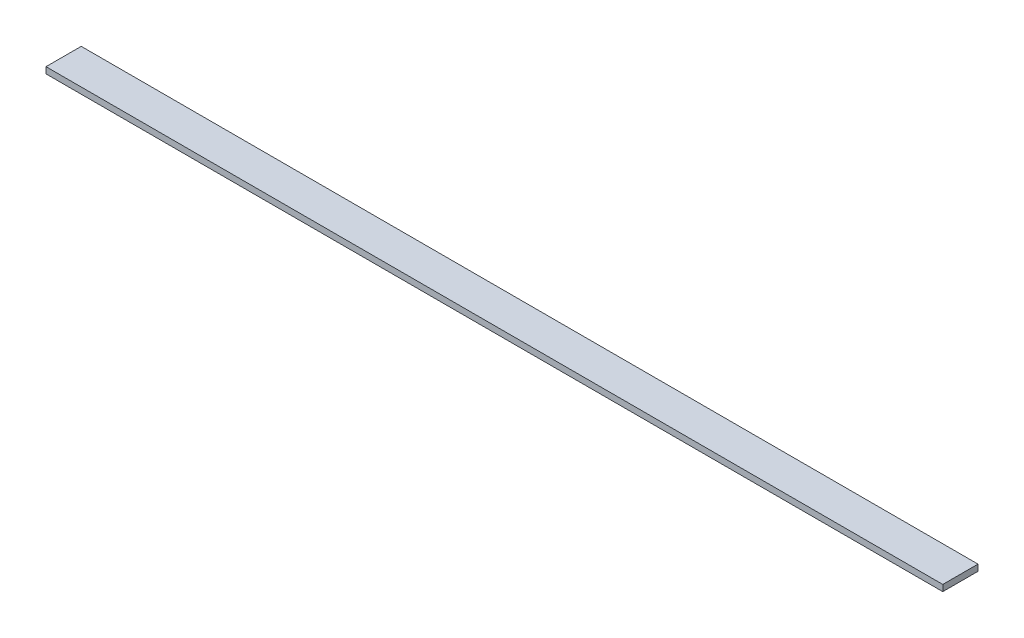
ISO-10303-21;
HEADER;
FILE_DESCRIPTION(('STEP AP214'),'2;1');
FILE_NAME('part.step','',(''),(''),'','','');
FILE_SCHEMA(('AUTOMOTIVE_DESIGN { 1 0 10303 214 1 1 1 1 }'));
ENDSEC;
DATA;
#1=APPLICATION_CONTEXT('core data for automotive mechanical design processes');
#2=APPLICATION_PROTOCOL_DEFINITION('international standard','automotive_design',2000,#1);
#3=PRODUCT_CONTEXT('',#1,'mechanical');
#4=PRODUCT('Part','Part','',(#3));
#5=PRODUCT_RELATED_PRODUCT_CATEGORY('part','',(#4));
#6=PRODUCT_DEFINITION_FORMATION('','',#4);
#7=PRODUCT_DEFINITION_CONTEXT('part definition',#1,'design');
#8=PRODUCT_DEFINITION('design','',#6,#7);
#9=PRODUCT_DEFINITION_SHAPE('','',#8);
#10=(LENGTH_UNIT() NAMED_UNIT(*) SI_UNIT(.MILLI.,.METRE.));
#11=(NAMED_UNIT(*) PLANE_ANGLE_UNIT() SI_UNIT($,.RADIAN.));
#12=(NAMED_UNIT(*) SI_UNIT($,.STERADIAN.) SOLID_ANGLE_UNIT());
#13=UNCERTAINTY_MEASURE_WITH_UNIT(LENGTH_MEASURE(1.E-05),#10,'distance_accuracy_value','');
#14=(GEOMETRIC_REPRESENTATION_CONTEXT(3) GLOBAL_UNCERTAINTY_ASSIGNED_CONTEXT((#13)) GLOBAL_UNIT_ASSIGNED_CONTEXT((#10,
#11,#12)) REPRESENTATION_CONTEXT('',''));
#15=CARTESIAN_POINT('',(0.,0.,0.));
#16=DIRECTION('',(0.,0.,1.));
#17=DIRECTION('',(1.,0.,0.));
#18=AXIS2_PLACEMENT_3D('',#15,#16,#17);
#19=CARTESIAN_POINT('',(-457.2,6.4,17.9500000000001));
#20=DIRECTION('',(1.,0.,0.));
#21=DIRECTION('',(0.,0.,-1.));
#22=AXIS2_PLACEMENT_3D('',#19,#20,#21);
#23=PLANE('',#22);
#24=DIRECTION('',(0.,0.,1.));
#25=VECTOR('',#24,1.);
#26=CARTESIAN_POINT('',(-457.2,0.,17.9500000000001));
#27=LINE('',#26,#25);
#28=CARTESIAN_POINT('',(-457.2,0.,-17.9499999999999));
#29=VERTEX_POINT('',#28);
#30=CARTESIAN_POINT('',(-457.2,0.,17.9500000000001));
#31=VERTEX_POINT('',#30);
#32=EDGE_CURVE('E96',#29,#31,#27,.T.);
#33=ORIENTED_EDGE('',*,*,#32,.T.);
#34=DIRECTION('',(0.,-1.,0.));
#35=VECTOR('',#34,1.);
#36=CARTESIAN_POINT('',(-457.2,6.4,17.9500000000001));
#37=LINE('',#36,#35);
#38=CARTESIAN_POINT('',(-457.2,6.4,17.9500000000001));
#39=VERTEX_POINT('',#38);
#40=EDGE_CURVE('E11',#39,#31,#37,.T.);
#41=ORIENTED_EDGE('',*,*,#40,.F.);
#42=DIRECTION('',(0.,0.,1.));
#43=VECTOR('',#42,1.);
#44=CARTESIAN_POINT('',(-457.2,6.4,17.9500000000001));
#45=LINE('',#44,#43);
#46=CARTESIAN_POINT('',(-457.2,6.4,-17.9499999999999));
#47=VERTEX_POINT('',#46);
#48=EDGE_CURVE('E84',#47,#39,#45,.T.);
#49=ORIENTED_EDGE('',*,*,#48,.F.);
#50=DIRECTION('',(0.,-1.,0.));
#51=VECTOR('',#50,1.);
#52=CARTESIAN_POINT('',(-457.2,6.4,-17.9499999999999));
#53=LINE('',#52,#51);
#54=EDGE_CURVE('E92',#47,#29,#53,.T.);
#55=ORIENTED_EDGE('',*,*,#54,.T.);
#56=EDGE_LOOP('',(#33,#41,#49,#55));
#57=FACE_BOUND('',#56,.T.);
#58=ADVANCED_FACE('F33',(#57),#23,.F.);
#59=CARTESIAN_POINT('',(457.2,6.4,17.95));
#60=DIRECTION('',(0.,0.,-1.));
#61=DIRECTION('',(-1.,0.,0.));
#62=AXIS2_PLACEMENT_3D('',#59,#60,#61);
#63=PLANE('',#62);
#64=DIRECTION('',(1.,0.,0.));
#65=VECTOR('',#64,1.);
#66=CARTESIAN_POINT('',(457.2,0.,17.95));
#67=LINE('',#66,#65);
#68=CARTESIAN_POINT('',(457.2,0.,17.95));
#69=VERTEX_POINT('',#68);
#70=EDGE_CURVE('E88',#31,#69,#67,.T.);
#71=ORIENTED_EDGE('',*,*,#70,.T.);
#72=DIRECTION('',(0.,-1.,0.));
#73=VECTOR('',#72,1.);
#74=CARTESIAN_POINT('',(457.2,6.4,17.95));
#75=LINE('',#74,#73);
#76=CARTESIAN_POINT('',(457.2,6.4,17.95));
#77=VERTEX_POINT('',#76);
#78=EDGE_CURVE('E41',#77,#69,#75,.T.);
#79=ORIENTED_EDGE('',*,*,#78,.F.);
#80=DIRECTION('',(1.,0.,0.));
#81=VECTOR('',#80,1.);
#82=CARTESIAN_POINT('',(457.2,6.4,17.95));
#83=LINE('',#82,#81);
#84=EDGE_CURVE('E79',#39,#77,#83,.T.);
#85=ORIENTED_EDGE('',*,*,#84,.F.);
#86=ORIENTED_EDGE('',*,*,#40,.T.);
#87=EDGE_LOOP('',(#71,#79,#85,#86));
#88=FACE_BOUND('',#87,.T.);
#89=ADVANCED_FACE('F87',(#88),#63,.F.);
#90=CARTESIAN_POINT('',(457.2,6.4,17.95));
#91=DIRECTION('',(-1.,0.,0.));
#92=DIRECTION('',(0.,0.,1.));
#93=AXIS2_PLACEMENT_3D('',#90,#91,#92);
#94=PLANE('',#93);
#95=DIRECTION('',(0.,0.,-1.));
#96=VECTOR('',#95,1.);
#97=CARTESIAN_POINT('',(457.2,0.,17.95));
#98=LINE('',#97,#96);
#99=CARTESIAN_POINT('',(457.2,0.,-17.95));
#100=VERTEX_POINT('',#99);
#101=EDGE_CURVE('E66',#69,#100,#98,.T.);
#102=ORIENTED_EDGE('',*,*,#101,.T.);
#103=DIRECTION('',(0.,-1.,0.));
#104=VECTOR('',#103,1.);
#105=CARTESIAN_POINT('',(457.2,6.4,-17.95));
#106=LINE('',#105,#104);
#107=CARTESIAN_POINT('',(457.2,6.4,-17.95));
#108=VERTEX_POINT('',#107);
#109=EDGE_CURVE('E89',#108,#100,#106,.T.);
#110=ORIENTED_EDGE('',*,*,#109,.F.);
#111=DIRECTION('',(0.,0.,-1.));
#112=VECTOR('',#111,1.);
#113=CARTESIAN_POINT('',(457.2,6.4,17.95));
#114=LINE('',#113,#112);
#115=EDGE_CURVE('E82',#77,#108,#114,.T.);
#116=ORIENTED_EDGE('',*,*,#115,.F.);
#117=ORIENTED_EDGE('',*,*,#78,.T.);
#118=EDGE_LOOP('',(#102,#110,#116,#117));
#119=FACE_BOUND('',#118,.T.);
#120=ADVANCED_FACE('F90',(#119),#94,.F.);
#121=CARTESIAN_POINT('',(457.2,6.4,-17.95));
#122=DIRECTION('',(0.,0.,1.));
#123=DIRECTION('',(1.,0.,0.));
#124=AXIS2_PLACEMENT_3D('',#121,#122,#123);
#125=PLANE('',#124);
#126=DIRECTION('',(-1.,0.,0.));
#127=VECTOR('',#126,1.);
#128=CARTESIAN_POINT('',(457.2,0.,-17.95));
#129=LINE('',#128,#127);
#130=EDGE_CURVE('E72',#100,#29,#129,.T.);
#131=ORIENTED_EDGE('',*,*,#130,.T.);
#132=ORIENTED_EDGE('',*,*,#54,.F.);
#133=DIRECTION('',(-1.,0.,0.));
#134=VECTOR('',#133,1.);
#135=CARTESIAN_POINT('',(457.2,6.4,-17.95));
#136=LINE('',#135,#134);
#137=EDGE_CURVE('E49',#108,#47,#136,.T.);
#138=ORIENTED_EDGE('',*,*,#137,.F.);
#139=ORIENTED_EDGE('',*,*,#109,.T.);
#140=EDGE_LOOP('',(#131,#132,#138,#139));
#141=FACE_BOUND('',#140,.T.);
#142=ADVANCED_FACE('F103',(#141),#125,.F.);
#143=CARTESIAN_POINT('',(0.,6.4,0.));
#144=DIRECTION('',(0.,1.,0.));
#145=DIRECTION('',(0.,0.,1.));
#146=AXIS2_PLACEMENT_3D('',#143,#144,#145);
#147=PLANE('',#146);
#148=ORIENTED_EDGE('',*,*,#48,.T.);
#149=ORIENTED_EDGE('',*,*,#84,.T.);
#150=ORIENTED_EDGE('',*,*,#115,.T.);
#151=ORIENTED_EDGE('',*,*,#137,.T.);
#152=EDGE_LOOP('',(#148,#149,#150,#151));
#153=FACE_BOUND('',#152,.T.);
#154=ADVANCED_FACE('F80',(#153),#147,.T.);
#155=CARTESIAN_POINT('',(0.,0.,0.));
#156=DIRECTION('',(0.,1.,0.));
#157=DIRECTION('',(0.,0.,1.));
#158=AXIS2_PLACEMENT_3D('',#155,#156,#157);
#159=PLANE('',#158);
#160=ORIENTED_EDGE('',*,*,#32,.F.);
#161=ORIENTED_EDGE('',*,*,#130,.F.);
#162=ORIENTED_EDGE('',*,*,#101,.F.);
#163=ORIENTED_EDGE('',*,*,#70,.F.);
#164=EDGE_LOOP('',(#160,#161,#162,#163));
#165=FACE_BOUND('',#164,.T.);
#166=ADVANCED_FACE('F106',(#165),#159,.F.);
#167=CLOSED_SHELL('',(#58,#89,#120,#142,#154,#166));
#168=MANIFOLD_SOLID_BREP('B2',#167);
#169=ADVANCED_BREP_SHAPE_REPRESENTATION('',(#18,#168),#14);
#170=SHAPE_DEFINITION_REPRESENTATION(#9,#169);
ENDSEC;
END-ISO-10303-21;
